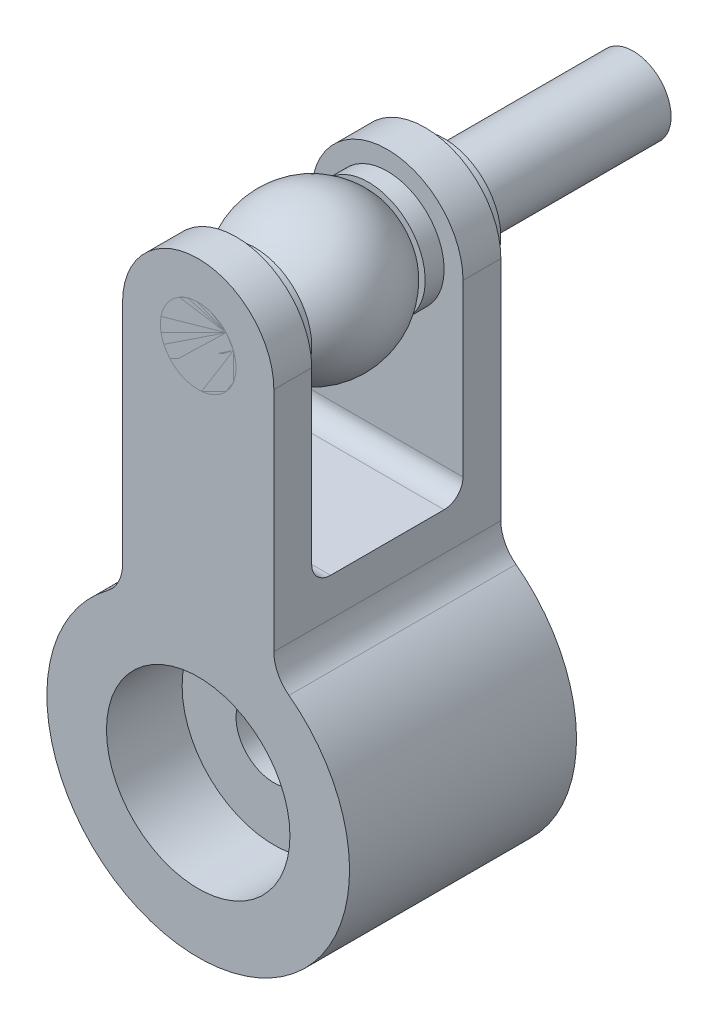
ISO-10303-21;
HEADER;
FILE_DESCRIPTION(('STEP AP214'),'2;1');
FILE_NAME('part.step','',(''),(''),'','','');
FILE_SCHEMA(('AUTOMOTIVE_DESIGN { 1 0 10303 214 1 1 1 1 }'));
ENDSEC;
DATA;
#1=APPLICATION_CONTEXT('core data for automotive mechanical design processes');
#2=APPLICATION_PROTOCOL_DEFINITION('international standard','automotive_design',2000,#1);
#3=PRODUCT_CONTEXT('',#1,'mechanical');
#4=PRODUCT('Part','Part','',(#3));
#5=PRODUCT_RELATED_PRODUCT_CATEGORY('part','',(#4));
#6=PRODUCT_DEFINITION_FORMATION('','',#4);
#7=PRODUCT_DEFINITION_CONTEXT('part definition',#1,'design');
#8=PRODUCT_DEFINITION('design','',#6,#7);
#9=PRODUCT_DEFINITION_SHAPE('','',#8);
#10=(LENGTH_UNIT() NAMED_UNIT(*) SI_UNIT(.MILLI.,.METRE.));
#11=(NAMED_UNIT(*) PLANE_ANGLE_UNIT() SI_UNIT($,.RADIAN.));
#12=(NAMED_UNIT(*) SI_UNIT($,.STERADIAN.) SOLID_ANGLE_UNIT());
#13=UNCERTAINTY_MEASURE_WITH_UNIT(LENGTH_MEASURE(1.E-05),#10,'distance_accuracy_value','');
#14=(GEOMETRIC_REPRESENTATION_CONTEXT(3) GLOBAL_UNCERTAINTY_ASSIGNED_CONTEXT((#13)) GLOBAL_UNIT_ASSIGNED_CONTEXT((#10,
#11,#12)) REPRESENTATION_CONTEXT('',''));
#15=CARTESIAN_POINT('',(0.,0.,0.));
#16=DIRECTION('',(0.,0.,1.));
#17=DIRECTION('',(1.,0.,0.));
#18=AXIS2_PLACEMENT_3D('',#15,#16,#17);
#19=CARTESIAN_POINT('',(0.,10.,-3.5));
#20=DIRECTION('',(0.,0.,-1.));
#21=DIRECTION('',(-1.,0.,0.));
#22=AXIS2_PLACEMENT_3D('',#19,#20,#21);
#23=PLANE('',#22);
#24=CARTESIAN_POINT('',(0.,10.,-3.5));
#25=DIRECTION('',(0.,0.,-1.));
#26=DIRECTION('',(-1.,0.,0.));
#27=AXIS2_PLACEMENT_3D('',#24,#25,#26);
#28=CIRCLE('',#27,1.5);
#29=CARTESIAN_POINT('',(-1.5,10.,-3.5));
#30=VERTEX_POINT('',#29);
#31=EDGE_CURVE('E12',#30,#30,#28,.T.);
#32=ORIENTED_EDGE('',*,*,#31,.T.);
#33=EDGE_LOOP('',(#32));
#34=FACE_BOUND('',#33,.T.);
#35=CARTESIAN_POINT('',(0.,10.,-3.5));
#36=DIRECTION('',(0.,0.,-1.));
#37=DIRECTION('',(-1.,0.,0.));
#38=AXIS2_PLACEMENT_3D('',#35,#36,#37);
#39=CIRCLE('',#38,1.);
#40=CARTESIAN_POINT('',(-1.,10.,-3.5));
#41=VERTEX_POINT('',#40);
#42=EDGE_CURVE('E58',#41,#41,#39,.T.);
#43=ORIENTED_EDGE('',*,*,#42,.F.);
#44=EDGE_LOOP('',(#43));
#45=FACE_BOUND('',#44,.T.);
#46=ADVANCED_FACE('F47',(#34,#45),#23,.T.);
#47=CARTESIAN_POINT('',(0.,10.,-3.));
#48=DIRECTION('',(0.,0.,-1.));
#49=DIRECTION('',(-1.,0.,0.));
#50=AXIS2_PLACEMENT_3D('',#47,#48,#49);
#51=PLANE('',#50);
#52=CARTESIAN_POINT('',(0.,10.,-3.));
#53=DIRECTION('',(0.,0.,-1.));
#54=DIRECTION('',(-1.,0.,0.));
#55=AXIS2_PLACEMENT_3D('',#52,#53,#54);
#56=CIRCLE('',#55,1.5);
#57=CARTESIAN_POINT('',(-1.5,10.,-3.));
#58=VERTEX_POINT('',#57);
#59=EDGE_CURVE('E51',#58,#58,#56,.T.);
#60=ORIENTED_EDGE('',*,*,#59,.F.);
#61=EDGE_LOOP('',(#60));
#62=FACE_BOUND('',#61,.T.);
#63=CARTESIAN_POINT('',(0.,10.,-3.));
#64=DIRECTION('',(0.,0.,-1.));
#65=DIRECTION('',(-1.,0.,0.));
#66=AXIS2_PLACEMENT_3D('',#63,#64,#65);
#67=CIRCLE('',#66,1.);
#68=CARTESIAN_POINT('',(-1.,10.,-3.));
#69=VERTEX_POINT('',#68);
#70=EDGE_CURVE('E60',#69,#69,#67,.T.);
#71=ORIENTED_EDGE('',*,*,#70,.T.);
#72=EDGE_LOOP('',(#71));
#73=FACE_BOUND('',#72,.T.);
#74=ADVANCED_FACE('F70',(#62,#73),#51,.F.);
#75=CARTESIAN_POINT('',(0.,10.,-3.5));
#76=DIRECTION('',(0.,0.,1.));
#77=DIRECTION('',(1.,0.,0.));
#78=AXIS2_PLACEMENT_3D('',#75,#76,#77);
#79=CYLINDRICAL_SURFACE('',#78,1.5);
#80=ORIENTED_EDGE('',*,*,#31,.F.);
#81=EDGE_LOOP('',(#80));
#82=FACE_BOUND('',#81,.T.);
#83=ORIENTED_EDGE('',*,*,#59,.T.);
#84=EDGE_LOOP('',(#83));
#85=FACE_BOUND('',#84,.T.);
#86=ADVANCED_FACE('F49',(#82,#85),#79,.T.);
#87=CARTESIAN_POINT('',(0.,10.,-3.5));
#88=DIRECTION('',(0.,0.,1.));
#89=DIRECTION('',(1.,0.,0.));
#90=AXIS2_PLACEMENT_3D('',#87,#88,#89);
#91=CYLINDRICAL_SURFACE('',#90,1.);
#92=ORIENTED_EDGE('',*,*,#42,.T.);
#93=EDGE_LOOP('',(#92));
#94=FACE_BOUND('',#93,.T.);
#95=ORIENTED_EDGE('',*,*,#70,.F.);
#96=EDGE_LOOP('',(#95));
#97=FACE_BOUND('',#96,.T.);
#98=ADVANCED_FACE('F66',(#94,#97),#91,.F.);
#99=CLOSED_SHELL('',(#46,#74,#86,#98));
#100=MANIFOLD_SOLID_BREP('B2',#99);
#101=CARTESIAN_POINT('',(0.,10.,-2.));
#102=DIRECTION('',(0.,0.,-1.));
#103=DIRECTION('',(-1.,0.,0.));
#104=AXIS2_PLACEMENT_3D('',#101,#102,#103);
#105=PLANE('',#104);
#106=CARTESIAN_POINT('',(0.,10.,-2.));
#107=DIRECTION('',(0.,0.,-1.));
#108=DIRECTION('',(-1.,0.,0.));
#109=AXIS2_PLACEMENT_3D('',#106,#107,#108);
#110=CIRCLE('',#109,1.5);
#111=CARTESIAN_POINT('',(-1.5,10.,-2.));
#112=VERTEX_POINT('',#111);
#113=EDGE_CURVE('E46',#112,#112,#110,.T.);
#114=ORIENTED_EDGE('',*,*,#113,.T.);
#115=EDGE_LOOP('',(#114));
#116=FACE_BOUND('',#115,.T.);
#117=CARTESIAN_POINT('',(0.,10.,-2.));
#118=DIRECTION('',(0.,0.,-1.));
#119=DIRECTION('',(-1.,0.,0.));
#120=AXIS2_PLACEMENT_3D('',#117,#118,#119);
#121=CIRCLE('',#120,1.);
#122=CARTESIAN_POINT('',(-1.,10.,-2.));
#123=VERTEX_POINT('',#122);
#124=EDGE_CURVE('E128',#123,#123,#121,.T.);
#125=ORIENTED_EDGE('',*,*,#124,.F.);
#126=EDGE_LOOP('',(#125));
#127=FACE_BOUND('',#126,.T.);
#128=ADVANCED_FACE('F117',(#116,#127),#105,.T.);
#129=CARTESIAN_POINT('',(0.,10.,-1.5));
#130=DIRECTION('',(0.,0.,-1.));
#131=DIRECTION('',(-1.,0.,0.));
#132=AXIS2_PLACEMENT_3D('',#129,#130,#131);
#133=PLANE('',#132);
#134=CARTESIAN_POINT('',(0.,10.,-1.5));
#135=DIRECTION('',(0.,0.,-1.));
#136=DIRECTION('',(-1.,0.,0.));
#137=AXIS2_PLACEMENT_3D('',#134,#135,#136);
#138=CIRCLE('',#137,1.5);
#139=CARTESIAN_POINT('',(-1.5,10.,-1.5));
#140=VERTEX_POINT('',#139);
#141=EDGE_CURVE('E121',#140,#140,#138,.T.);
#142=ORIENTED_EDGE('',*,*,#141,.F.);
#143=EDGE_LOOP('',(#142));
#144=FACE_BOUND('',#143,.T.);
#145=CARTESIAN_POINT('',(0.,10.,-1.5));
#146=DIRECTION('',(0.,0.,-1.));
#147=DIRECTION('',(-1.,0.,0.));
#148=AXIS2_PLACEMENT_3D('',#145,#146,#147);
#149=CIRCLE('',#148,1.);
#150=CARTESIAN_POINT('',(-1.,10.,-1.5));
#151=VERTEX_POINT('',#150);
#152=EDGE_CURVE('E130',#151,#151,#149,.T.);
#153=ORIENTED_EDGE('',*,*,#152,.T.);
#154=EDGE_LOOP('',(#153));
#155=FACE_BOUND('',#154,.T.);
#156=ADVANCED_FACE('F140',(#144,#155),#133,.F.);
#157=CARTESIAN_POINT('',(0.,10.,-2.));
#158=DIRECTION('',(0.,0.,1.));
#159=DIRECTION('',(1.,0.,0.));
#160=AXIS2_PLACEMENT_3D('',#157,#158,#159);
#161=CYLINDRICAL_SURFACE('',#160,1.5);
#162=ORIENTED_EDGE('',*,*,#113,.F.);
#163=EDGE_LOOP('',(#162));
#164=FACE_BOUND('',#163,.T.);
#165=ORIENTED_EDGE('',*,*,#141,.T.);
#166=EDGE_LOOP('',(#165));
#167=FACE_BOUND('',#166,.T.);
#168=ADVANCED_FACE('F119',(#164,#167),#161,.T.);
#169=CARTESIAN_POINT('',(0.,10.,-2.));
#170=DIRECTION('',(0.,0.,1.));
#171=DIRECTION('',(1.,0.,0.));
#172=AXIS2_PLACEMENT_3D('',#169,#170,#171);
#173=CYLINDRICAL_SURFACE('',#172,1.);
#174=ORIENTED_EDGE('',*,*,#124,.T.);
#175=EDGE_LOOP('',(#174));
#176=FACE_BOUND('',#175,.T.);
#177=ORIENTED_EDGE('',*,*,#152,.F.);
#178=EDGE_LOOP('',(#177));
#179=FACE_BOUND('',#178,.T.);
#180=ADVANCED_FACE('F136',(#176,#179),#173,.F.);
#181=CLOSED_SHELL('',(#128,#156,#168,#180));
#182=MANIFOLD_SOLID_BREP('B7',#181);
#183=CARTESIAN_POINT('',(0.,10.,2.));
#184=DIRECTION('',(0.,0.,1.));
#185=DIRECTION('',(1.,0.,0.));
#186=AXIS2_PLACEMENT_3D('',#183,#184,#185);
#187=PLANE('',#186);
#188=CARTESIAN_POINT('',(0.,10.,2.));
#189=DIRECTION('',(0.,0.,1.));
#190=DIRECTION('',(1.,0.,0.));
#191=AXIS2_PLACEMENT_3D('',#188,#189,#190);
#192=CIRCLE('',#191,1.5);
#193=CARTESIAN_POINT('',(1.5,10.,2.));
#194=VERTEX_POINT('',#193);
#195=EDGE_CURVE('E116',#194,#194,#192,.T.);
#196=ORIENTED_EDGE('',*,*,#195,.T.);
#197=EDGE_LOOP('',(#196));
#198=FACE_BOUND('',#197,.T.);
#199=CARTESIAN_POINT('',(0.,10.,2.));
#200=DIRECTION('',(0.,0.,1.));
#201=DIRECTION('',(1.,0.,0.));
#202=AXIS2_PLACEMENT_3D('',#199,#200,#201);
#203=CIRCLE('',#202,1.);
#204=CARTESIAN_POINT('',(1.,10.,2.));
#205=VERTEX_POINT('',#204);
#206=EDGE_CURVE('E198',#205,#205,#203,.T.);
#207=ORIENTED_EDGE('',*,*,#206,.F.);
#208=EDGE_LOOP('',(#207));
#209=FACE_BOUND('',#208,.T.);
#210=ADVANCED_FACE('F187',(#198,#209),#187,.T.);
#211=CARTESIAN_POINT('',(0.,10.,1.5));
#212=DIRECTION('',(0.,0.,1.));
#213=DIRECTION('',(1.,0.,0.));
#214=AXIS2_PLACEMENT_3D('',#211,#212,#213);
#215=PLANE('',#214);
#216=CARTESIAN_POINT('',(0.,10.,1.5));
#217=DIRECTION('',(0.,0.,1.));
#218=DIRECTION('',(1.,0.,0.));
#219=AXIS2_PLACEMENT_3D('',#216,#217,#218);
#220=CIRCLE('',#219,1.5);
#221=CARTESIAN_POINT('',(1.5,10.,1.5));
#222=VERTEX_POINT('',#221);
#223=EDGE_CURVE('E191',#222,#222,#220,.T.);
#224=ORIENTED_EDGE('',*,*,#223,.F.);
#225=EDGE_LOOP('',(#224));
#226=FACE_BOUND('',#225,.T.);
#227=CARTESIAN_POINT('',(0.,10.,1.5));
#228=DIRECTION('',(0.,0.,1.));
#229=DIRECTION('',(1.,0.,0.));
#230=AXIS2_PLACEMENT_3D('',#227,#228,#229);
#231=CIRCLE('',#230,1.);
#232=CARTESIAN_POINT('',(1.,10.,1.5));
#233=VERTEX_POINT('',#232);
#234=EDGE_CURVE('E200',#233,#233,#231,.T.);
#235=ORIENTED_EDGE('',*,*,#234,.T.);
#236=EDGE_LOOP('',(#235));
#237=FACE_BOUND('',#236,.T.);
#238=ADVANCED_FACE('F210',(#226,#237),#215,.F.);
#239=CARTESIAN_POINT('',(0.,10.,2.));
#240=DIRECTION('',(0.,0.,-1.));
#241=DIRECTION('',(-1.,0.,0.));
#242=AXIS2_PLACEMENT_3D('',#239,#240,#241);
#243=CYLINDRICAL_SURFACE('',#242,1.5);
#244=ORIENTED_EDGE('',*,*,#195,.F.);
#245=EDGE_LOOP('',(#244));
#246=FACE_BOUND('',#245,.T.);
#247=ORIENTED_EDGE('',*,*,#223,.T.);
#248=EDGE_LOOP('',(#247));
#249=FACE_BOUND('',#248,.T.);
#250=ADVANCED_FACE('F189',(#246,#249),#243,.T.);
#251=CARTESIAN_POINT('',(0.,10.,2.));
#252=DIRECTION('',(0.,0.,-1.));
#253=DIRECTION('',(-1.,0.,0.));
#254=AXIS2_PLACEMENT_3D('',#251,#252,#253);
#255=CYLINDRICAL_SURFACE('',#254,1.);
#256=ORIENTED_EDGE('',*,*,#206,.T.);
#257=EDGE_LOOP('',(#256));
#258=FACE_BOUND('',#257,.T.);
#259=ORIENTED_EDGE('',*,*,#234,.F.);
#260=EDGE_LOOP('',(#259));
#261=FACE_BOUND('',#260,.T.);
#262=ADVANCED_FACE('F206',(#258,#261),#255,.F.);
#263=CLOSED_SHELL('',(#210,#238,#250,#262));
#264=MANIFOLD_SOLID_BREP('B41',#263);
#265=CARTESIAN_POINT('',(0.,0.,-1.5));
#266=DIRECTION('',(0.,0.,-1.));
#267=DIRECTION('',(-1.,0.,0.));
#268=AXIS2_PLACEMENT_3D('',#265,#266,#267);
#269=PLANE('',#268);
#270=CARTESIAN_POINT('',(0.,10.,-1.5));
#271=DIRECTION('',(0.,0.,1.));
#272=DIRECTION('',(1.,0.,0.));
#273=AXIS2_PLACEMENT_3D('',#270,#271,#272);
#274=CIRCLE('',#273,0.999999999999999);
#275=CARTESIAN_POINT('',(0.999999999999999,10.,-1.5));
#276=VERTEX_POINT('',#275);
#277=EDGE_CURVE('E271',#276,#276,#274,.T.);
#278=ORIENTED_EDGE('',*,*,#277,.T.);
#279=EDGE_LOOP('',(#278));
#280=FACE_BOUND('',#279,.T.);
#281=CARTESIAN_POINT('',(0.,10.,-1.5));
#282=DIRECTION('',(0.,0.,1.));
#283=DIRECTION('',(1.,0.,0.));
#284=AXIS2_PLACEMENT_3D('',#281,#282,#283);
#285=CIRCLE('',#284,1.3228756555323);
#286=CARTESIAN_POINT('',(0.,11.3228756555323,-1.5));
#287=VERTEX_POINT('',#286);
#288=EDGE_CURVE('E186',#287,#287,#285,.T.);
#289=ORIENTED_EDGE('',*,*,#288,.F.);
#290=EDGE_LOOP('',(#289));
#291=FACE_BOUND('',#290,.T.);
#292=ADVANCED_FACE('F257',(#280,#291),#269,.T.);
#293=CARTESIAN_POINT('',(0.,10.,0.));
#294=DIRECTION('',(0.,0.,1.));
#295=DIRECTION('',(0.,1.,0.));
#296=AXIS2_PLACEMENT_3D('',#293,#294,#295);
#297=SPHERICAL_SURFACE('',#296,2.);
#298=CARTESIAN_POINT('',(0.,10.,1.5));
#299=DIRECTION('',(0.,0.,1.));
#300=DIRECTION('',(1.,0.,0.));
#301=AXIS2_PLACEMENT_3D('',#298,#299,#300);
#302=CIRCLE('',#301,1.3228756555323);
#303=CARTESIAN_POINT('',(0.,11.3228756555323,1.5));
#304=VERTEX_POINT('',#303);
#305=EDGE_CURVE('E263',#304,#304,#302,.T.);
#306=CARTESIAN_POINT('',(0.,11.3228756555323,1.5));
#307=CARTESIAN_POINT('',(0.,11.3493782559357,1.47662816139122));
#308=CARTESIAN_POINT('',(0.,11.3752601484217,1.45255263723511));
#309=CARTESIAN_POINT('',(0.,11.425712726278,1.40306480128789));
#310=CARTESIAN_POINT('',(0.,11.4502834116484,1.37765248949678));
#311=CARTESIAN_POINT('',(0.,11.4980437839927,1.32556166173927));
#312=CARTESIAN_POINT('',(0.,11.5212334709667,1.29888314577287));
#313=CARTESIAN_POINT('',(0.,11.5661669209403,1.24433505565076));
#314=CARTESIAN_POINT('',(0.,11.58791068394,1.21646548149505));
#315=CARTESIAN_POINT('',(0.,11.6298911572142,1.15961349679346));
#316=CARTESIAN_POINT('',(0.,11.6501278674887,1.13063108624758));
#317=CARTESIAN_POINT('',(0.,11.6890374103518,1.07163484848067));
#318=CARTESIAN_POINT('',(0.,11.7077102429404,1.04162102125963));
#319=CARTESIAN_POINT('',(0.,11.7434395790337,0.980646247498051));
#320=CARTESIAN_POINT('',(0.,11.7604960825384,0.949685300957505));
#321=CARTESIAN_POINT('',(0.,11.792944854023,0.88690325132344));
#322=CARTESIAN_POINT('',(0.,11.808337122003,0.855082148229921));
#323=CARTESIAN_POINT('',(0.,11.8374141890616,0.790669162834669));
#324=CARTESIAN_POINT('',(0.,11.8510989881403,0.758077280532937));
#325=CARTESIAN_POINT('',(0.,11.8767226802449,0.692214279367253));
#326=CARTESIAN_POINT('',(0.,11.8886615732707,0.658943160503301));
#327=CARTESIAN_POINT('',(0.,11.9107599198396,0.591815136567553));
#328=CARTESIAN_POINT('',(0.,11.9209193733828,0.557958231495757));
#329=CARTESIAN_POINT('',(0.,11.9394303055903,0.48975373085456));
#330=CARTESIAN_POINT('',(0.,11.9477817842546,0.455406135285158));
#331=CARTESIAN_POINT('',(0.,11.9626533094568,0.386316727580535));
#332=CARTESIAN_POINT('',(0.,11.9691733559947,0.351574915445313));
#333=CARTESIAN_POINT('',(0.,11.9803637037403,0.28179465579996));
#334=CARTESIAN_POINT('',(0.,11.9850340049481,0.246756208289829));
#335=CARTESIAN_POINT('',(0.,11.9925117443077,0.176481092260735));
#336=CARTESIAN_POINT('',(0.,11.9953191824597,0.141244423741772));
#337=CARTESIAN_POINT('',(0.,11.9990633103058,0.0706718368152061));
#338=CARTESIAN_POINT('',(0.,12.,0.0353359184076028));
#339=CARTESIAN_POINT('',(0.,12.,-0.0353359184076037));
#340=CARTESIAN_POINT('',(0.,11.9990633103058,-0.070671836815207));
#341=CARTESIAN_POINT('',(0.,11.9953191824597,-0.141244423741773));
#342=CARTESIAN_POINT('',(0.,11.9925117443077,-0.176481092260736));
#343=CARTESIAN_POINT('',(0.,11.9850340049481,-0.24675620828983));
#344=CARTESIAN_POINT('',(0.,11.9803637037403,-0.281794655799961));
#345=CARTESIAN_POINT('',(0.,11.9691733559947,-0.351574915445314));
#346=CARTESIAN_POINT('',(0.,11.9626533094568,-0.386316727580536));
#347=CARTESIAN_POINT('',(0.,11.9477817842546,-0.455406135285159));
#348=CARTESIAN_POINT('',(0.,11.9394303055903,-0.48975373085456));
#349=CARTESIAN_POINT('',(0.,11.9209193733828,-0.557958231495758));
#350=CARTESIAN_POINT('',(0.,11.9107599198396,-0.591815136567554));
#351=CARTESIAN_POINT('',(0.,11.8886615732707,-0.658943160503302));
#352=CARTESIAN_POINT('',(0.,11.8767226802449,-0.692214279367254));
#353=CARTESIAN_POINT('',(0.,11.8510989881403,-0.758077280532938));
#354=CARTESIAN_POINT('',(0.,11.8374141890616,-0.79066916283467));
#355=CARTESIAN_POINT('',(0.,11.808337122003,-0.855082148229921));
#356=CARTESIAN_POINT('',(0.,11.792944854023,-0.886903251323441));
#357=CARTESIAN_POINT('',(0.,11.7604960825384,-0.949685300957506));
#358=CARTESIAN_POINT('',(0.,11.7434395790337,-0.980646247498052));
#359=CARTESIAN_POINT('',(0.,11.7077102429404,-1.04162102125963));
#360=CARTESIAN_POINT('',(0.,11.6890374103518,-1.07163484848067));
#361=CARTESIAN_POINT('',(0.,11.6501278674887,-1.13063108624759));
#362=CARTESIAN_POINT('',(0.,11.6298911572142,-1.15961349679346));
#363=CARTESIAN_POINT('',(0.,11.58791068394,-1.21646548149505));
#364=CARTESIAN_POINT('',(0.,11.5661669209403,-1.24433505565076));
#365=CARTESIAN_POINT('',(0.,11.5212334709667,-1.29888314577287));
#366=CARTESIAN_POINT('',(0.,11.4980437839927,-1.32556166173928));
#367=CARTESIAN_POINT('',(0.,11.4502834116484,-1.37765248949678));
#368=CARTESIAN_POINT('',(0.,11.425712726278,-1.40306480128789));
#369=CARTESIAN_POINT('',(0.,11.3752601484217,-1.45255263723511));
#370=CARTESIAN_POINT('',(0.,11.3493782559357,-1.47662816139122));
#371=CARTESIAN_POINT('',(0.,11.3228756555323,-1.5));
#372=B_SPLINE_CURVE_WITH_KNOTS('',3,(#306,#307,#308,#309,#310,#311,#312,#313,#314,#315,#316,
#317,#318,#319,#320,#321,#322,#323,#324,#325,#326,#327,#328,#329,#330,#331,#332,#333,#334,#335,
#336,#337,#338,#339,#340,#341,#342,#343,#344,#345,#346,#347,#348,#349,#350,#351,#352,#353,#354,
#355,#356,#357,#358,#359,#360,#361,#362,#363,#364,#365,#366,#367,#368,#369,#370,#371),
.UNSPECIFIED.,.F.,.F.,(4,2,2,2,2,2,2,2,2,2,2,2,2,2,2,2,2,2,2,2,2,2,2,2,2,2,2,2,2,2,2,2,4),(0.,
0.105995351166906,0.211990702333812,0.317986053500718,0.423981404667624,0.52997675583453,
0.635972107001436,0.741967458168343,0.847962809335249,0.953958160502155,1.05995351166906,
1.16594886283597,1.27194421400287,1.37793956516978,1.48393491633669,1.58993026750359,
1.6959256186705,1.80192096983741,1.90791632100431,2.01391167217122,2.11990702333812,
2.22590237450503,2.33189772567194,2.43789307683884,2.54388842800575,2.64988377917265,
2.75587913033956,2.86187448150647,2.96786983267337,3.07386518384028,3.17986053500719,
3.28585588617409,3.391851237341),.UNSPECIFIED.);
#373=EDGE_CURVE('BSEAM287',#304,#287,#372,.T.);
#374=ORIENTED_EDGE('',*,*,#305,.F.);
#375=ORIENTED_EDGE('',*,*,#288,.T.);
#376=ORIENTED_EDGE('',*,*,#373,.T.);
#377=ORIENTED_EDGE('',*,*,#373,.F.);
#378=EDGE_LOOP('',(#374,#376,#375,#377));
#379=FACE_BOUND('',#378,.T.);
#380=ADVANCED_FACE('F287',(#379),#297,.T.);
#381=CARTESIAN_POINT('',(0.,0.,1.5));
#382=DIRECTION('',(0.,0.,-1.));
#383=DIRECTION('',(-1.,0.,0.));
#384=AXIS2_PLACEMENT_3D('',#381,#382,#383);
#385=PLANE('',#384);
#386=CARTESIAN_POINT('',(0.,10.,1.5));
#387=DIRECTION('',(0.,0.,1.));
#388=DIRECTION('',(1.,0.,0.));
#389=AXIS2_PLACEMENT_3D('',#386,#387,#388);
#390=CIRCLE('',#389,0.999999999999999);
#391=CARTESIAN_POINT('',(0.999999999999999,10.,1.5));
#392=VERTEX_POINT('',#391);
#393=EDGE_CURVE('E267',#392,#392,#390,.T.);
#394=ORIENTED_EDGE('',*,*,#393,.F.);
#395=EDGE_LOOP('',(#394));
#396=FACE_BOUND('',#395,.T.);
#397=ORIENTED_EDGE('',*,*,#305,.T.);
#398=EDGE_LOOP('',(#397));
#399=FACE_BOUND('',#398,.T.);
#400=ADVANCED_FACE('F282',(#396,#399),#385,.F.);
#401=CARTESIAN_POINT('',(0.,10.,3.));
#402=DIRECTION('',(0.,0.,1.));
#403=DIRECTION('',(1.,0.,0.));
#404=AXIS2_PLACEMENT_3D('',#401,#402,#403);
#405=CYLINDRICAL_SURFACE('',#404,0.999999999999999);
#406=ORIENTED_EDGE('',*,*,#277,.F.);
#407=EDGE_LOOP('',(#406));
#408=FACE_BOUND('',#407,.T.);
#409=ORIENTED_EDGE('',*,*,#393,.T.);
#410=EDGE_LOOP('',(#409));
#411=FACE_BOUND('',#410,.T.);
#412=ADVANCED_FACE('F279',(#408,#411),#405,.F.);
#413=CLOSED_SHELL('',(#292,#380,#400,#412));
#414=MANIFOLD_SOLID_BREP('B111',#413);
#415=CARTESIAN_POINT('',(0.,10.,3.));
#416=DIRECTION('',(0.,0.,-1.));
#417=DIRECTION('',(-1.,0.,0.));
#418=AXIS2_PLACEMENT_3D('',#415,#416,#417);
#419=CYLINDRICAL_SURFACE('',#418,1.);
#420=CARTESIAN_POINT('',(0.,10.,3.));
#421=DIRECTION('',(0.,0.,1.));
#422=DIRECTION('',(1.,0.,0.));
#423=AXIS2_PLACEMENT_3D('',#420,#421,#422);
#424=CIRCLE('',#423,1.);
#425=CARTESIAN_POINT('',(1.,10.,3.));
#426=VERTEX_POINT('',#425);
#427=EDGE_CURVE('E256',#426,#426,#424,.T.);
#428=ORIENTED_EDGE('',*,*,#427,.F.);
#429=EDGE_LOOP('',(#428));
#430=FACE_BOUND('',#429,.T.);
#431=CARTESIAN_POINT('',(0.,10.,-8.5));
#432=DIRECTION('',(0.,0.,1.));
#433=DIRECTION('',(1.,0.,0.));
#434=AXIS2_PLACEMENT_3D('',#431,#432,#433);
#435=CIRCLE('',#434,1.);
#436=CARTESIAN_POINT('',(1.,10.,-8.5));
#437=VERTEX_POINT('',#436);
#438=EDGE_CURVE('E329',#437,#437,#435,.T.);
#439=ORIENTED_EDGE('',*,*,#438,.T.);
#440=EDGE_LOOP('',(#439));
#441=FACE_BOUND('',#440,.T.);
#442=ADVANCED_FACE('F325',(#430,#441),#419,.T.);
#443=CARTESIAN_POINT('',(0.,10.,3.));
#444=DIRECTION('',(0.,0.,1.));
#445=DIRECTION('',(1.,0.,0.));
#446=AXIS2_PLACEMENT_3D('',#443,#444,#445);
#447=PLANE('',#446);
#448=ORIENTED_EDGE('',*,*,#427,.T.);
#449=EDGE_LOOP('',(#448));
#450=FACE_BOUND('',#449,.T.);
#451=ADVANCED_FACE('F340',(#450),#447,.T.);
#452=CARTESIAN_POINT('',(0.,10.,-8.5));
#453=DIRECTION('',(0.,0.,1.));
#454=DIRECTION('',(1.,0.,0.));
#455=AXIS2_PLACEMENT_3D('',#452,#453,#454);
#456=PLANE('',#455);
#457=ORIENTED_EDGE('',*,*,#438,.F.);
#458=EDGE_LOOP('',(#457));
#459=FACE_BOUND('',#458,.T.);
#460=ADVANCED_FACE('F327',(#459),#456,.F.);
#461=CLOSED_SHELL('',(#442,#451,#460));
#462=MANIFOLD_SOLID_BREP('B181',#461);
#463=CARTESIAN_POINT('',(0.,10.,0.));
#464=DIRECTION('',(0.,0.,1.));
#465=DIRECTION('',(0.,1.,0.));
#466=AXIS2_PLACEMENT_3D('',#463,#464,#465);
#467=SPHERICAL_SURFACE('',#466,0.5);
#468=CARTESIAN_POINT('',(0.,10.,0.5));
#469=VERTEX_POINT('',#468);
#470=VERTEX_LOOP('',#469);
#471=FACE_BOUND('',#470,.T.);
#472=ADVANCED_FACE('F376',(#471),#467,.T.);
#473=CLOSED_SHELL('',(#472));
#474=MANIFOLD_SOLID_BREP('B251',#473);
#475=CARTESIAN_POINT('',(0.,0.,14.3137084989848));
#476=DIRECTION('',(0.,0.,-1.));
#477=DIRECTION('',(-1.,0.,0.));
#478=AXIS2_PLACEMENT_3D('',#475,#476,#477);
#479=CYLINDRICAL_SURFACE('',#478,4.);
#480=CARTESIAN_POINT('',(0.,0.,-3.));
#481=DIRECTION('',(0.,0.,-1.));
#482=DIRECTION('',(-1.,0.,0.));
#483=AXIS2_PLACEMENT_3D('',#480,#481,#482);
#484=CIRCLE('',#483,4.);
#485=CARTESIAN_POINT('',(2.4,3.2,-3.));
#486=VERTEX_POINT('',#485);
#487=CARTESIAN_POINT('',(-2.4,3.2,-3.));
#488=VERTEX_POINT('',#487);
#489=EDGE_CURVE('E550',#486,#488,#484,.T.);
#490=ORIENTED_EDGE('',*,*,#489,.F.);
#491=DIRECTION('',(0.,0.,-1.));
#492=VECTOR('',#491,1.);
#493=CARTESIAN_POINT('',(2.4,3.2,14.3137084989848));
#494=LINE('',#493,#492);
#495=CARTESIAN_POINT('',(2.4,3.2,3.));
#496=VERTEX_POINT('',#495);
#497=EDGE_CURVE('E564',#486,#496,#494,.F.);
#498=ORIENTED_EDGE('',*,*,#497,.T.);
#499=CARTESIAN_POINT('',(0.,0.,3.));
#500=DIRECTION('',(0.,0.,1.));
#501=DIRECTION('',(1.,0.,0.));
#502=AXIS2_PLACEMENT_3D('',#499,#500,#501);
#503=CIRCLE('',#502,4.);
#504=CARTESIAN_POINT('',(-2.4,3.2,3.));
#505=VERTEX_POINT('',#504);
#506=EDGE_CURVE('E553',#496,#505,#503,.F.);
#507=ORIENTED_EDGE('',*,*,#506,.T.);
#508=DIRECTION('',(0.,0.,-1.));
#509=VECTOR('',#508,1.);
#510=CARTESIAN_POINT('',(-2.4,3.2,14.3137084989848));
#511=LINE('',#510,#509);
#512=EDGE_CURVE('E556',#505,#488,#511,.T.);
#513=ORIENTED_EDGE('',*,*,#512,.T.);
#514=EDGE_LOOP('',(#490,#498,#507,#513));
#515=FACE_BOUND('',#514,.T.);
#516=ADVANCED_FACE('F396',(#515),#479,.T.);
#517=CARTESIAN_POINT('',(0.,0.,-3.));
#518=DIRECTION('',(0.,0.,1.));
#519=DIRECTION('',(1.,0.,0.));
#520=AXIS2_PLACEMENT_3D('',#517,#518,#519);
#521=PLANE('',#520);
#522=CARTESIAN_POINT('',(0.,0.,-3.));
#523=DIRECTION('',(0.,0.,-1.));
#524=DIRECTION('',(-1.,0.,0.));
#525=AXIS2_PLACEMENT_3D('',#522,#523,#524);
#526=CIRCLE('',#525,2.425);
#527=CARTESIAN_POINT('',(-2.425,0.,-3.));
#528=VERTEX_POINT('',#527);
#529=EDGE_CURVE('E560',#528,#528,#526,.T.);
#530=ORIENTED_EDGE('',*,*,#529,.F.);
#531=EDGE_LOOP('',(#530));
#532=FACE_BOUND('',#531,.T.);
#533=DIRECTION('',(0.,1.,0.));
#534=VECTOR('',#533,1.);
#535=CARTESIAN_POINT('',(2.,-2.001,-3.));
#536=LINE('',#535,#534);
#537=CARTESIAN_POINT('',(2.,4.,-3.));
#538=VERTEX_POINT('',#537);
#539=CARTESIAN_POINT('',(2.,10.,-3.));
#540=VERTEX_POINT('',#539);
#541=EDGE_CURVE('E489',#538,#540,#536,.T.);
#542=ORIENTED_EDGE('',*,*,#541,.F.);
#543=CARTESIAN_POINT('',(3.,4.,-3.));
#544=DIRECTION('',(0.,0.,1.));
#545=DIRECTION('',(1.,0.,0.));
#546=AXIS2_PLACEMENT_3D('',#543,#544,#545);
#547=CIRCLE('',#546,1.);
#548=EDGE_CURVE('E573',#538,#486,#547,.T.);
#549=ORIENTED_EDGE('',*,*,#548,.T.);
#550=ORIENTED_EDGE('',*,*,#489,.T.);
#551=CARTESIAN_POINT('',(-3.,4.,-3.));
#552=DIRECTION('',(0.,0.,1.));
#553=DIRECTION('',(1.,0.,0.));
#554=AXIS2_PLACEMENT_3D('',#551,#552,#553);
#555=CIRCLE('',#554,1.);
#556=CARTESIAN_POINT('',(-2.,4.,-3.));
#557=VERTEX_POINT('',#556);
#558=EDGE_CURVE('E575',#488,#557,#555,.T.);
#559=ORIENTED_EDGE('',*,*,#558,.T.);
#560=DIRECTION('',(0.,1.,0.));
#561=VECTOR('',#560,1.);
#562=CARTESIAN_POINT('',(-2.,-2.001,-3.));
#563=LINE('',#562,#561);
#564=CARTESIAN_POINT('',(-2.,10.,-3.));
#565=VERTEX_POINT('',#564);
#566=EDGE_CURVE('E520',#557,#565,#563,.T.);
#567=ORIENTED_EDGE('',*,*,#566,.T.);
#568=CARTESIAN_POINT('',(0.,10.,-3.));
#569=DIRECTION('',(0.,0.,-1.));
#570=DIRECTION('',(-1.,0.,0.));
#571=AXIS2_PLACEMENT_3D('',#568,#569,#570);
#572=CIRCLE('',#571,2.);
#573=EDGE_CURVE('E504',#565,#540,#572,.T.);
#574=ORIENTED_EDGE('',*,*,#573,.T.);
#575=EDGE_LOOP('',(#542,#549,#550,#559,#567,#574));
#576=FACE_BOUND('',#575,.T.);
#577=CARTESIAN_POINT('',(0.,10.,-3.));
#578=DIRECTION('',(0.,0.,-1.));
#579=DIRECTION('',(-1.,0.,0.));
#580=AXIS2_PLACEMENT_3D('',#577,#578,#579);
#581=CIRCLE('',#580,1.);
#582=CARTESIAN_POINT('',(-1.,10.,-3.));
#583=VERTEX_POINT('',#582);
#584=EDGE_CURVE('E509',#583,#583,#581,.T.);
#585=ORIENTED_EDGE('',*,*,#584,.F.);
#586=EDGE_LOOP('',(#585));
#587=FACE_BOUND('',#586,.T.);
#588=ADVANCED_FACE('F621',(#532,#576,#587),#521,.F.);
#589=CARTESIAN_POINT('',(0.,0.,3.));
#590=DIRECTION('',(0.,0.,1.));
#591=DIRECTION('',(1.,0.,0.));
#592=AXIS2_PLACEMENT_3D('',#589,#590,#591);
#593=PLANE('',#592);
#594=CARTESIAN_POINT('',(0.,0.,3.));
#595=DIRECTION('',(0.,0.,-1.));
#596=DIRECTION('',(-1.,0.,0.));
#597=AXIS2_PLACEMENT_3D('',#594,#595,#596);
#598=CIRCLE('',#597,2.425);
#599=CARTESIAN_POINT('',(-2.425,0.,3.));
#600=VERTEX_POINT('',#599);
#601=EDGE_CURVE('E847',#600,#600,#598,.T.);
#602=ORIENTED_EDGE('',*,*,#601,.T.);
#603=EDGE_LOOP('',(#602));
#604=FACE_BOUND('',#603,.T.);
#605=ORIENTED_EDGE('',*,*,#506,.F.);
#606=CARTESIAN_POINT('',(3.,4.,3.));
#607=DIRECTION('',(0.,0.,1.));
#608=DIRECTION('',(1.,0.,0.));
#609=AXIS2_PLACEMENT_3D('',#606,#607,#608);
#610=CIRCLE('',#609,1.);
#611=CARTESIAN_POINT('',(2.,4.,3.));
#612=VERTEX_POINT('',#611);
#613=EDGE_CURVE('E571',#496,#612,#610,.F.);
#614=ORIENTED_EDGE('',*,*,#613,.T.);
#615=DIRECTION('',(0.,1.,0.));
#616=VECTOR('',#615,1.);
#617=CARTESIAN_POINT('',(2.,5.,3.));
#618=LINE('',#617,#616);
#619=CARTESIAN_POINT('',(2.,10.,3.));
#620=VERTEX_POINT('',#619);
#621=EDGE_CURVE('E536',#612,#620,#618,.T.);
#622=ORIENTED_EDGE('',*,*,#621,.T.);
#623=CARTESIAN_POINT('',(0.,10.,3.));
#624=DIRECTION('',(0.,0.,1.));
#625=DIRECTION('',(1.,0.,0.));
#626=AXIS2_PLACEMENT_3D('',#623,#624,#625);
#627=CIRCLE('',#626,2.);
#628=CARTESIAN_POINT('',(-2.,10.,3.));
#629=VERTEX_POINT('',#628);
#630=EDGE_CURVE('E529',#620,#629,#627,.T.);
#631=ORIENTED_EDGE('',*,*,#630,.T.);
#632=DIRECTION('',(0.,-1.,0.));
#633=VECTOR('',#632,1.);
#634=CARTESIAN_POINT('',(-2.,10.,3.));
#635=LINE('',#634,#633);
#636=CARTESIAN_POINT('',(-2.,4.,3.));
#637=VERTEX_POINT('',#636);
#638=EDGE_CURVE('E532',#629,#637,#635,.T.);
#639=ORIENTED_EDGE('',*,*,#638,.T.);
#640=CARTESIAN_POINT('',(-3.,4.,3.));
#641=DIRECTION('',(0.,0.,1.));
#642=DIRECTION('',(1.,0.,0.));
#643=AXIS2_PLACEMENT_3D('',#640,#641,#642);
#644=CIRCLE('',#643,1.);
#645=EDGE_CURVE('E577',#637,#505,#644,.F.);
#646=ORIENTED_EDGE('',*,*,#645,.T.);
#647=EDGE_LOOP('',(#605,#614,#622,#631,#639,#646));
#648=FACE_BOUND('',#647,.T.);
#649=CARTESIAN_POINT('',(0.,10.,3.));
#650=DIRECTION('',(0.,0.,1.));
#651=DIRECTION('',(1.,0.,0.));
#652=AXIS2_PLACEMENT_3D('',#649,#650,#651);
#653=CIRCLE('',#652,1.);
#654=CARTESIAN_POINT('',(1.,10.,3.));
#655=VERTEX_POINT('',#654);
#656=EDGE_CURVE('E523',#655,#655,#653,.T.);
#657=ORIENTED_EDGE('',*,*,#656,.F.);
#658=EDGE_LOOP('',(#657));
#659=FACE_BOUND('',#658,.T.);
#660=ADVANCED_FACE('F640',(#604,#648,#659),#593,.T.);
#661=CARTESIAN_POINT('',(0.,5.,0.));
#662=DIRECTION('',(0.,-1.,0.));
#663=DIRECTION('',(0.,0.,-1.));
#664=AXIS2_PLACEMENT_3D('',#661,#662,#663);
#665=PLANE('',#664);
#666=DIRECTION('',(0.,0.,-1.));
#667=VECTOR('',#666,1.);
#668=CARTESIAN_POINT('',(-2.,5.,3.));
#669=LINE('',#668,#667);
#670=CARTESIAN_POINT('',(-2.,5.,1.5));
#671=VERTEX_POINT('',#670);
#672=CARTESIAN_POINT('',(-2.,5.,-1.5));
#673=VERTEX_POINT('',#672);
#674=EDGE_CURVE('E513',#671,#673,#669,.T.);
#675=ORIENTED_EDGE('',*,*,#674,.F.);
#676=DIRECTION('',(1.,0.,0.));
#677=VECTOR('',#676,1.);
#678=CARTESIAN_POINT('',(2.,5.,1.5));
#679=LINE('',#678,#677);
#680=CARTESIAN_POINT('',(2.,5.,1.5));
#681=VERTEX_POINT('',#680);
#682=EDGE_CURVE('E582',#671,#681,#679,.T.);
#683=ORIENTED_EDGE('',*,*,#682,.T.);
#684=DIRECTION('',(0.,0.,1.));
#685=VECTOR('',#684,1.);
#686=CARTESIAN_POINT('',(2.,5.,3.));
#687=LINE('',#686,#685);
#688=CARTESIAN_POINT('',(2.,5.,-1.5));
#689=VERTEX_POINT('',#688);
#690=EDGE_CURVE('E516',#689,#681,#687,.T.);
#691=ORIENTED_EDGE('',*,*,#690,.F.);
#692=DIRECTION('',(-1.,0.,0.));
#693=VECTOR('',#692,1.);
#694=CARTESIAN_POINT('',(-2.,5.,-1.5));
#695=LINE('',#694,#693);
#696=EDGE_CURVE('E579',#689,#673,#695,.T.);
#697=ORIENTED_EDGE('',*,*,#696,.T.);
#698=EDGE_LOOP('',(#675,#683,#691,#697));
#699=FACE_BOUND('',#698,.T.);
#700=ADVANCED_FACE('F599',(#699),#665,.F.);
#701=CARTESIAN_POINT('',(0.,10.,2.));
#702=DIRECTION('',(0.,0.,1.));
#703=DIRECTION('',(1.,0.,0.));
#704=AXIS2_PLACEMENT_3D('',#701,#702,#703);
#705=PLANE('',#704);
#706=DIRECTION('',(0.,1.,0.));
#707=VECTOR('',#706,1.);
#708=CARTESIAN_POINT('',(2.,5.,2.));
#709=LINE('',#708,#707);
#710=CARTESIAN_POINT('',(2.,5.5,2.));
#711=VERTEX_POINT('',#710);
#712=CARTESIAN_POINT('',(2.,10.,2.));
#713=VERTEX_POINT('',#712);
#714=EDGE_CURVE('E533',#711,#713,#709,.T.);
#715=ORIENTED_EDGE('',*,*,#714,.F.);
#716=DIRECTION('',(1.,0.,0.));
#717=VECTOR('',#716,1.);
#718=CARTESIAN_POINT('',(-2.,5.5,2.));
#719=LINE('',#718,#717);
#720=CARTESIAN_POINT('',(-2.,5.5,2.));
#721=VERTEX_POINT('',#720);
#722=EDGE_CURVE('E585',#711,#721,#719,.F.);
#723=ORIENTED_EDGE('',*,*,#722,.T.);
#724=DIRECTION('',(0.,-1.,0.));
#725=VECTOR('',#724,1.);
#726=CARTESIAN_POINT('',(-2.,10.,2.));
#727=LINE('',#726,#725);
#728=CARTESIAN_POINT('',(-2.,10.,2.));
#729=VERTEX_POINT('',#728);
#730=EDGE_CURVE('E541',#729,#721,#727,.T.);
#731=ORIENTED_EDGE('',*,*,#730,.F.);
#732=CARTESIAN_POINT('',(0.,10.,2.));
#733=DIRECTION('',(0.,0.,1.));
#734=DIRECTION('',(1.,0.,0.));
#735=AXIS2_PLACEMENT_3D('',#732,#733,#734);
#736=CIRCLE('',#735,2.);
#737=EDGE_CURVE('E526',#713,#729,#736,.T.);
#738=ORIENTED_EDGE('',*,*,#737,.F.);
#739=EDGE_LOOP('',(#715,#723,#731,#738));
#740=FACE_BOUND('',#739,.T.);
#741=CARTESIAN_POINT('',(0.,10.,2.));
#742=DIRECTION('',(0.,0.,1.));
#743=DIRECTION('',(1.,0.,0.));
#744=AXIS2_PLACEMENT_3D('',#741,#742,#743);
#745=CIRCLE('',#744,1.);
#746=CARTESIAN_POINT('',(1.,10.,2.));
#747=VERTEX_POINT('',#746);
#748=EDGE_CURVE('E522',#747,#747,#745,.T.);
#749=ORIENTED_EDGE('',*,*,#748,.T.);
#750=EDGE_LOOP('',(#749));
#751=FACE_BOUND('',#750,.T.);
#752=ADVANCED_FACE('F607',(#740,#751),#705,.F.);
#753=CARTESIAN_POINT('',(0.,10.,3.));
#754=DIRECTION('',(0.,0.,-1.));
#755=DIRECTION('',(-1.,0.,0.));
#756=AXIS2_PLACEMENT_3D('',#753,#754,#755);
#757=CYLINDRICAL_SURFACE('',#756,2.);
#758=ORIENTED_EDGE('',*,*,#737,.T.);
#759=DIRECTION('',(0.,0.,-1.));
#760=VECTOR('',#759,1.);
#761=CARTESIAN_POINT('',(-2.,10.,3.));
#762=LINE('',#761,#760);
#763=EDGE_CURVE('E547',#629,#729,#762,.T.);
#764=ORIENTED_EDGE('',*,*,#763,.F.);
#765=ORIENTED_EDGE('',*,*,#630,.F.);
#766=DIRECTION('',(0.,0.,-1.));
#767=VECTOR('',#766,1.);
#768=CARTESIAN_POINT('',(2.,10.,3.));
#769=LINE('',#768,#767);
#770=EDGE_CURVE('E538',#620,#713,#769,.T.);
#771=ORIENTED_EDGE('',*,*,#770,.T.);
#772=EDGE_LOOP('',(#758,#764,#765,#771));
#773=FACE_BOUND('',#772,.T.);
#774=ADVANCED_FACE('F611',(#773),#757,.T.);
#775=CARTESIAN_POINT('',(-2.,10.,3.));
#776=DIRECTION('',(1.,0.,0.));
#777=DIRECTION('',(0.,0.,-1.));
#778=AXIS2_PLACEMENT_3D('',#775,#776,#777);
#779=PLANE('',#778);
#780=ORIENTED_EDGE('',*,*,#566,.F.);
#781=DIRECTION('',(0.,0.,-1.));
#782=VECTOR('',#781,1.);
#783=CARTESIAN_POINT('',(-2.,4.,3.));
#784=LINE('',#783,#782);
#785=EDGE_CURVE('E569',#557,#637,#784,.F.);
#786=ORIENTED_EDGE('',*,*,#785,.T.);
#787=ORIENTED_EDGE('',*,*,#638,.F.);
#788=ORIENTED_EDGE('',*,*,#763,.T.);
#789=ORIENTED_EDGE('',*,*,#730,.T.);
#790=CARTESIAN_POINT('',(-2.,5.5,1.5));
#791=DIRECTION('',(1.,0.,0.));
#792=DIRECTION('',(0.,0.,-1.));
#793=AXIS2_PLACEMENT_3D('',#790,#791,#792);
#794=CIRCLE('',#793,0.5);
#795=EDGE_CURVE('E590',#721,#671,#794,.T.);
#796=ORIENTED_EDGE('',*,*,#795,.T.);
#797=ORIENTED_EDGE('',*,*,#674,.T.);
#798=CARTESIAN_POINT('',(-2.,5.5,-1.5));
#799=DIRECTION('',(1.,0.,0.));
#800=DIRECTION('',(0.,0.,-1.));
#801=AXIS2_PLACEMENT_3D('',#798,#799,#800);
#802=CIRCLE('',#801,0.5);
#803=CARTESIAN_POINT('',(-2.,5.5,-2.));
#804=VERTEX_POINT('',#803);
#805=EDGE_CURVE('E404',#673,#804,#802,.T.);
#806=ORIENTED_EDGE('',*,*,#805,.T.);
#807=DIRECTION('',(0.,1.,0.));
#808=VECTOR('',#807,1.);
#809=CARTESIAN_POINT('',(-2.,5.,-2.));
#810=LINE('',#809,#808);
#811=CARTESIAN_POINT('',(-2.,10.,-2.));
#812=VERTEX_POINT('',#811);
#813=EDGE_CURVE('E495',#804,#812,#810,.T.);
#814=ORIENTED_EDGE('',*,*,#813,.T.);
#815=DIRECTION('',(0.,0.,-1.));
#816=VECTOR('',#815,1.);
#817=CARTESIAN_POINT('',(-2.,10.,-2.));
#818=LINE('',#817,#816);
#819=EDGE_CURVE('E494',#812,#565,#818,.T.);
#820=ORIENTED_EDGE('',*,*,#819,.T.);
#821=EDGE_LOOP('',(#780,#786,#787,#788,#789,#796,#797,#806,#814,#820));
#822=FACE_BOUND('',#821,.T.);
#823=ADVANCED_FACE('F594',(#822),#779,.F.);
#824=CARTESIAN_POINT('',(2.,5.,3.));
#825=DIRECTION('',(-1.,0.,0.));
#826=DIRECTION('',(0.,0.,1.));
#827=AXIS2_PLACEMENT_3D('',#824,#825,#826);
#828=PLANE('',#827);
#829=ORIENTED_EDGE('',*,*,#621,.F.);
#830=DIRECTION('',(0.,0.,-1.));
#831=VECTOR('',#830,1.);
#832=CARTESIAN_POINT('',(2.,4.,3.));
#833=LINE('',#832,#831);
#834=EDGE_CURVE('E567',#612,#538,#833,.T.);
#835=ORIENTED_EDGE('',*,*,#834,.T.);
#836=ORIENTED_EDGE('',*,*,#541,.T.);
#837=DIRECTION('',(0.,0.,-1.));
#838=VECTOR('',#837,1.);
#839=CARTESIAN_POINT('',(2.,10.,-2.));
#840=LINE('',#839,#838);
#841=CARTESIAN_POINT('',(2.,10.,-2.));
#842=VERTEX_POINT('',#841);
#843=EDGE_CURVE('E483',#842,#540,#840,.T.);
#844=ORIENTED_EDGE('',*,*,#843,.F.);
#845=DIRECTION('',(0.,-1.,0.));
#846=VECTOR('',#845,1.);
#847=CARTESIAN_POINT('',(2.,10.,-2.));
#848=LINE('',#847,#846);
#849=CARTESIAN_POINT('',(2.,5.5,-2.));
#850=VERTEX_POINT('',#849);
#851=EDGE_CURVE('E486',#842,#850,#848,.T.);
#852=ORIENTED_EDGE('',*,*,#851,.T.);
#853=CARTESIAN_POINT('',(2.,5.5,-1.5));
#854=DIRECTION('',(-1.,0.,0.));
#855=DIRECTION('',(0.,0.,1.));
#856=AXIS2_PLACEMENT_3D('',#853,#854,#855);
#857=CIRCLE('',#856,0.5);
#858=EDGE_CURVE('E374',#850,#689,#857,.T.);
#859=ORIENTED_EDGE('',*,*,#858,.T.);
#860=ORIENTED_EDGE('',*,*,#690,.T.);
#861=CARTESIAN_POINT('',(2.,5.5,1.5));
#862=DIRECTION('',(-1.,0.,0.));
#863=DIRECTION('',(0.,0.,1.));
#864=AXIS2_PLACEMENT_3D('',#861,#862,#863);
#865=CIRCLE('',#864,0.5);
#866=EDGE_CURVE('E588',#681,#711,#865,.T.);
#867=ORIENTED_EDGE('',*,*,#866,.T.);
#868=ORIENTED_EDGE('',*,*,#714,.T.);
#869=ORIENTED_EDGE('',*,*,#770,.F.);
#870=EDGE_LOOP('',(#829,#835,#836,#844,#852,#859,#860,#867,#868,#869));
#871=FACE_BOUND('',#870,.T.);
#872=ADVANCED_FACE('F485',(#871),#828,.F.);
#873=CARTESIAN_POINT('',(0.,10.,3.));
#874=DIRECTION('',(0.,0.,-1.));
#875=DIRECTION('',(-1.,0.,0.));
#876=AXIS2_PLACEMENT_3D('',#873,#874,#875);
#877=CYLINDRICAL_SURFACE('',#876,1.);
#878=ORIENTED_EDGE('',*,*,#656,.T.);
#879=EDGE_LOOP('',(#878));
#880=FACE_BOUND('',#879,.T.);
#881=ORIENTED_EDGE('',*,*,#748,.F.);
#882=EDGE_LOOP('',(#881));
#883=FACE_BOUND('',#882,.T.);
#884=ADVANCED_FACE('F690',(#880,#883),#877,.F.);
#885=CARTESIAN_POINT('',(0.,10.,-2.));
#886=DIRECTION('',(0.,0.,-1.));
#887=DIRECTION('',(-1.,0.,0.));
#888=AXIS2_PLACEMENT_3D('',#885,#886,#887);
#889=CYLINDRICAL_SURFACE('',#888,2.);
#890=ORIENTED_EDGE('',*,*,#573,.F.);
#891=ORIENTED_EDGE('',*,*,#819,.F.);
#892=CARTESIAN_POINT('',(0.,10.,-2.));
#893=DIRECTION('',(0.,0.,-1.));
#894=DIRECTION('',(-1.,0.,0.));
#895=AXIS2_PLACEMENT_3D('',#892,#893,#894);
#896=CIRCLE('',#895,2.);
#897=EDGE_CURVE('E499',#812,#842,#896,.T.);
#898=ORIENTED_EDGE('',*,*,#897,.T.);
#899=ORIENTED_EDGE('',*,*,#843,.T.);
#900=EDGE_LOOP('',(#890,#891,#898,#899));
#901=FACE_BOUND('',#900,.T.);
#902=ADVANCED_FACE('F502',(#901),#889,.T.);
#903=CARTESIAN_POINT('',(0.,10.,-2.));
#904=DIRECTION('',(0.,0.,-1.));
#905=DIRECTION('',(-1.,0.,0.));
#906=AXIS2_PLACEMENT_3D('',#903,#904,#905);
#907=PLANE('',#906);
#908=CARTESIAN_POINT('',(0.,10.,-2.));
#909=DIRECTION('',(0.,0.,-1.));
#910=DIRECTION('',(-1.,0.,0.));
#911=AXIS2_PLACEMENT_3D('',#908,#909,#910);
#912=CIRCLE('',#911,1.);
#913=CARTESIAN_POINT('',(-1.,10.,-2.));
#914=VERTEX_POINT('',#913);
#915=EDGE_CURVE('E506',#914,#914,#912,.T.);
#916=ORIENTED_EDGE('',*,*,#915,.T.);
#917=EDGE_LOOP('',(#916));
#918=FACE_BOUND('',#917,.T.);
#919=ORIENTED_EDGE('',*,*,#813,.F.);
#920=DIRECTION('',(-1.,0.,0.));
#921=VECTOR('',#920,1.);
#922=CARTESIAN_POINT('',(2.,5.5,-2.));
#923=LINE('',#922,#921);
#924=EDGE_CURVE('E411',#804,#850,#923,.F.);
#925=ORIENTED_EDGE('',*,*,#924,.T.);
#926=ORIENTED_EDGE('',*,*,#851,.F.);
#927=ORIENTED_EDGE('',*,*,#897,.F.);
#928=EDGE_LOOP('',(#919,#925,#926,#927));
#929=FACE_BOUND('',#928,.T.);
#930=ADVANCED_FACE('F498',(#918,#929),#907,.F.);
#931=CARTESIAN_POINT('',(0.,10.,-2.));
#932=DIRECTION('',(0.,0.,-1.));
#933=DIRECTION('',(-1.,0.,0.));
#934=AXIS2_PLACEMENT_3D('',#931,#932,#933);
#935=CYLINDRICAL_SURFACE('',#934,1.);
#936=ORIENTED_EDGE('',*,*,#915,.F.);
#937=EDGE_LOOP('',(#936));
#938=FACE_BOUND('',#937,.T.);
#939=ORIENTED_EDGE('',*,*,#584,.T.);
#940=EDGE_LOOP('',(#939));
#941=FACE_BOUND('',#940,.T.);
#942=ADVANCED_FACE('F676',(#938,#941),#935,.F.);
#943=CARTESIAN_POINT('',(0.,0.,1.));
#944=DIRECTION('',(0.,0.,1.));
#945=DIRECTION('',(1.,0.,0.));
#946=AXIS2_PLACEMENT_3D('',#943,#944,#945);
#947=CYLINDRICAL_SURFACE('',#946,2.425);
#948=CARTESIAN_POINT('',(0.,0.,1.));
#949=DIRECTION('',(0.,0.,-1.));
#950=DIRECTION('',(-1.,0.,0.));
#951=AXIS2_PLACEMENT_3D('',#948,#949,#950);
#952=CIRCLE('',#951,2.425);
#953=CARTESIAN_POINT('',(-2.425,0.,1.));
#954=VERTEX_POINT('',#953);
#955=EDGE_CURVE('E845',#954,#954,#952,.T.);
#956=ORIENTED_EDGE('',*,*,#955,.T.);
#957=EDGE_LOOP('',(#956));
#958=FACE_BOUND('',#957,.T.);
#959=ORIENTED_EDGE('',*,*,#601,.F.);
#960=EDGE_LOOP('',(#959));
#961=FACE_BOUND('',#960,.T.);
#962=ADVANCED_FACE('F767',(#958,#961),#947,.F.);
#963=CARTESIAN_POINT('',(0.,0.,1.));
#964=DIRECTION('',(0.,0.,-1.));
#965=DIRECTION('',(-1.,0.,0.));
#966=AXIS2_PLACEMENT_3D('',#963,#964,#965);
#967=PLANE('',#966);
#968=CARTESIAN_POINT('',(0.,0.,1.));
#969=DIRECTION('',(0.,0.,1.));
#970=DIRECTION('',(1.,0.,0.));
#971=AXIS2_PLACEMENT_3D('',#968,#969,#970);
#972=CIRCLE('',#971,1.);
#973=CARTESIAN_POINT('',(1.,0.,1.));
#974=VERTEX_POINT('',#973);
#975=EDGE_CURVE('E561',#974,#974,#972,.T.);
#976=ORIENTED_EDGE('',*,*,#975,.F.);
#977=EDGE_LOOP('',(#976));
#978=FACE_BOUND('',#977,.T.);
#979=ORIENTED_EDGE('',*,*,#955,.F.);
#980=EDGE_LOOP('',(#979));
#981=FACE_BOUND('',#980,.T.);
#982=ADVANCED_FACE('F762',(#978,#981),#967,.F.);
#983=CARTESIAN_POINT('',(0.,0.,-1.));
#984=DIRECTION('',(0.,0.,-1.));
#985=DIRECTION('',(-1.,0.,0.));
#986=AXIS2_PLACEMENT_3D('',#983,#984,#985);
#987=CYLINDRICAL_SURFACE('',#986,2.425);
#988=CARTESIAN_POINT('',(0.,0.,-1.));
#989=DIRECTION('',(0.,0.,-1.));
#990=DIRECTION('',(-1.,0.,0.));
#991=AXIS2_PLACEMENT_3D('',#988,#989,#990);
#992=CIRCLE('',#991,2.425);
#993=CARTESIAN_POINT('',(-2.425,0.,-1.));
#994=VERTEX_POINT('',#993);
#995=EDGE_CURVE('E851',#994,#994,#992,.T.);
#996=ORIENTED_EDGE('',*,*,#995,.F.);
#997=EDGE_LOOP('',(#996));
#998=FACE_BOUND('',#997,.T.);
#999=ORIENTED_EDGE('',*,*,#529,.T.);
#1000=EDGE_LOOP('',(#999));
#1001=FACE_BOUND('',#1000,.T.);
#1002=ADVANCED_FACE('F754',(#998,#1001),#987,.F.);
#1003=CARTESIAN_POINT('',(0.,0.,-1.));
#1004=DIRECTION('',(0.,0.,1.));
#1005=DIRECTION('',(-1.,0.,0.));
#1006=AXIS2_PLACEMENT_3D('',#1003,#1004,#1005);
#1007=PLANE('',#1006);
#1008=CARTESIAN_POINT('',(0.,0.,-1.));
#1009=DIRECTION('',(0.,0.,1.));
#1010=DIRECTION('',(1.,0.,0.));
#1011=AXIS2_PLACEMENT_3D('',#1008,#1009,#1010);
#1012=CIRCLE('',#1011,1.);
#1013=CARTESIAN_POINT('',(1.,0.,-1.));
#1014=VERTEX_POINT('',#1013);
#1015=EDGE_CURVE('E557',#1014,#1014,#1012,.T.);
#1016=ORIENTED_EDGE('',*,*,#1015,.T.);
#1017=EDGE_LOOP('',(#1016));
#1018=FACE_BOUND('',#1017,.T.);
#1019=ORIENTED_EDGE('',*,*,#995,.T.);
#1020=EDGE_LOOP('',(#1019));
#1021=FACE_BOUND('',#1020,.T.);
#1022=ADVANCED_FACE('F743',(#1018,#1021),#1007,.F.);
#1023=CARTESIAN_POINT('',(0.,0.,-3.));
#1024=DIRECTION('',(0.,0.,1.));
#1025=DIRECTION('',(1.,0.,0.));
#1026=AXIS2_PLACEMENT_3D('',#1023,#1024,#1025);
#1027=CYLINDRICAL_SURFACE('',#1026,1.);
#1028=ORIENTED_EDGE('',*,*,#975,.T.);
#1029=EDGE_LOOP('',(#1028));
#1030=FACE_BOUND('',#1029,.T.);
#1031=ORIENTED_EDGE('',*,*,#1015,.F.);
#1032=EDGE_LOOP('',(#1031));
#1033=FACE_BOUND('',#1032,.T.);
#1034=ADVANCED_FACE('F651',(#1030,#1033),#1027,.F.);
#1035=CARTESIAN_POINT('',(3.,4.,14.3137084989848));
#1036=DIRECTION('',(0.,0.,-1.));
#1037=DIRECTION('',(-1.,0.,0.));
#1038=AXIS2_PLACEMENT_3D('',#1035,#1036,#1037);
#1039=CYLINDRICAL_SURFACE('',#1038,1.);
#1040=ORIENTED_EDGE('',*,*,#548,.F.);
#1041=ORIENTED_EDGE('',*,*,#834,.F.);
#1042=ORIENTED_EDGE('',*,*,#613,.F.);
#1043=ORIENTED_EDGE('',*,*,#497,.F.);
#1044=EDGE_LOOP('',(#1040,#1041,#1042,#1043));
#1045=FACE_BOUND('',#1044,.T.);
#1046=ADVANCED_FACE('F617',(#1045),#1039,.F.);
#1047=CARTESIAN_POINT('',(-3.,4.,14.3137084989848));
#1048=DIRECTION('',(0.,0.,-1.));
#1049=DIRECTION('',(-1.,0.,0.));
#1050=AXIS2_PLACEMENT_3D('',#1047,#1048,#1049);
#1051=CYLINDRICAL_SURFACE('',#1050,1.);
#1052=ORIENTED_EDGE('',*,*,#645,.F.);
#1053=ORIENTED_EDGE('',*,*,#785,.F.);
#1054=ORIENTED_EDGE('',*,*,#558,.F.);
#1055=ORIENTED_EDGE('',*,*,#512,.F.);
#1056=EDGE_LOOP('',(#1052,#1053,#1054,#1055));
#1057=FACE_BOUND('',#1056,.T.);
#1058=ADVANCED_FACE('F628',(#1057),#1051,.F.);
#1059=CARTESIAN_POINT('',(0.,5.5,1.5));
#1060=DIRECTION('',(-1.,0.,0.));
#1061=DIRECTION('',(0.,0.,1.));
#1062=AXIS2_PLACEMENT_3D('',#1059,#1060,#1061);
#1063=CYLINDRICAL_SURFACE('',#1062,0.5);
#1064=ORIENTED_EDGE('',*,*,#795,.F.);
#1065=ORIENTED_EDGE('',*,*,#722,.F.);
#1066=ORIENTED_EDGE('',*,*,#866,.F.);
#1067=ORIENTED_EDGE('',*,*,#682,.F.);
#1068=EDGE_LOOP('',(#1064,#1065,#1066,#1067));
#1069=FACE_BOUND('',#1068,.T.);
#1070=ADVANCED_FACE('F602',(#1069),#1063,.F.);
#1071=CARTESIAN_POINT('',(0.,5.5,-1.5));
#1072=DIRECTION('',(1.,0.,0.));
#1073=DIRECTION('',(0.,0.,-1.));
#1074=AXIS2_PLACEMENT_3D('',#1071,#1072,#1073);
#1075=CYLINDRICAL_SURFACE('',#1074,0.5);
#1076=ORIENTED_EDGE('',*,*,#858,.F.);
#1077=ORIENTED_EDGE('',*,*,#924,.F.);
#1078=ORIENTED_EDGE('',*,*,#805,.F.);
#1079=ORIENTED_EDGE('',*,*,#696,.F.);
#1080=EDGE_LOOP('',(#1076,#1077,#1078,#1079));
#1081=FACE_BOUND('',#1080,.T.);
#1082=ADVANCED_FACE('F398',(#1081),#1075,.F.);
#1083=CLOSED_SHELL('',(#516,#588,#660,#700,#752,#774,#823,#872,#884,#902,#930,#942,#962,#982,
#1002,#1022,#1034,#1046,#1058,#1070,#1082));
#1084=MANIFOLD_SOLID_BREP('B321',#1083);
#1085=CARTESIAN_POINT('',(0.,10.,3.));
#1086=DIRECTION('',(0.,0.,-1.));
#1087=DIRECTION('',(-1.,0.,0.));
#1088=AXIS2_PLACEMENT_3D('',#1085,#1086,#1087);
#1089=CYLINDRICAL_SURFACE('',#1088,1.);
#1090=CARTESIAN_POINT('',(0.,10.,3.));
#1091=DIRECTION('',(0.,0.,1.));
#1092=DIRECTION('',(1.,0.,0.));
#1093=AXIS2_PLACEMENT_3D('',#1090,#1091,#1092);
#1094=CIRCLE('',#1093,1.);
#1095=CARTESIAN_POINT('',(1.,10.,3.));
#1096=VERTEX_POINT('',#1095);
#1097=EDGE_CURVE('E395',#1096,#1096,#1094,.T.);
#1098=ORIENTED_EDGE('',*,*,#1097,.F.);
#1099=EDGE_LOOP('',(#1098));
#1100=FACE_BOUND('',#1099,.T.);
#1101=CARTESIAN_POINT('',(0.,10.,-3.));
#1102=DIRECTION('',(0.,0.,1.));
#1103=DIRECTION('',(1.,0.,0.));
#1104=AXIS2_PLACEMENT_3D('',#1101,#1102,#1103);
#1105=CIRCLE('',#1104,1.);
#1106=CARTESIAN_POINT('',(1.,10.,-3.));
#1107=VERTEX_POINT('',#1106);
#1108=EDGE_CURVE('E890',#1107,#1107,#1105,.T.);
#1109=ORIENTED_EDGE('',*,*,#1108,.T.);
#1110=EDGE_LOOP('',(#1109));
#1111=FACE_BOUND('',#1110,.T.);
#1112=ADVANCED_FACE('F887',(#1100,#1111),#1089,.T.);
#1113=CARTESIAN_POINT('',(0.,10.,3.));
#1114=DIRECTION('',(0.,0.,1.));
#1115=DIRECTION('',(1.,0.,0.));
#1116=AXIS2_PLACEMENT_3D('',#1113,#1114,#1115);
#1117=PLANE('',#1116);
#1118=ORIENTED_EDGE('',*,*,#1097,.T.);
#1119=EDGE_LOOP('',(#1118));
#1120=FACE_BOUND('',#1119,.T.);
#1121=ADVANCED_FACE('F902',(#1120),#1117,.T.);
#1122=CARTESIAN_POINT('',(0.,10.,-3.));
#1123=DIRECTION('',(0.,0.,1.));
#1124=DIRECTION('',(1.,0.,0.));
#1125=AXIS2_PLACEMENT_3D('',#1122,#1123,#1124);
#1126=PLANE('',#1125);
#1127=ORIENTED_EDGE('',*,*,#1108,.F.);
#1128=EDGE_LOOP('',(#1127));
#1129=FACE_BOUND('',#1128,.T.);
#1130=ADVANCED_FACE('F900',(#1129),#1126,.F.);
#1131=CLOSED_SHELL('',(#1112,#1121,#1130));
#1132=MANIFOLD_SOLID_BREP('B368_NOT_SHOWN',#1131);
#1133=ADVANCED_BREP_SHAPE_REPRESENTATION('',(#18,#100,#182,#264,#414,#462,#474,#1084,#1132),#14);
#1134=SHAPE_DEFINITION_REPRESENTATION(#9,#1133);
ENDSEC;
END-ISO-10303-21;
